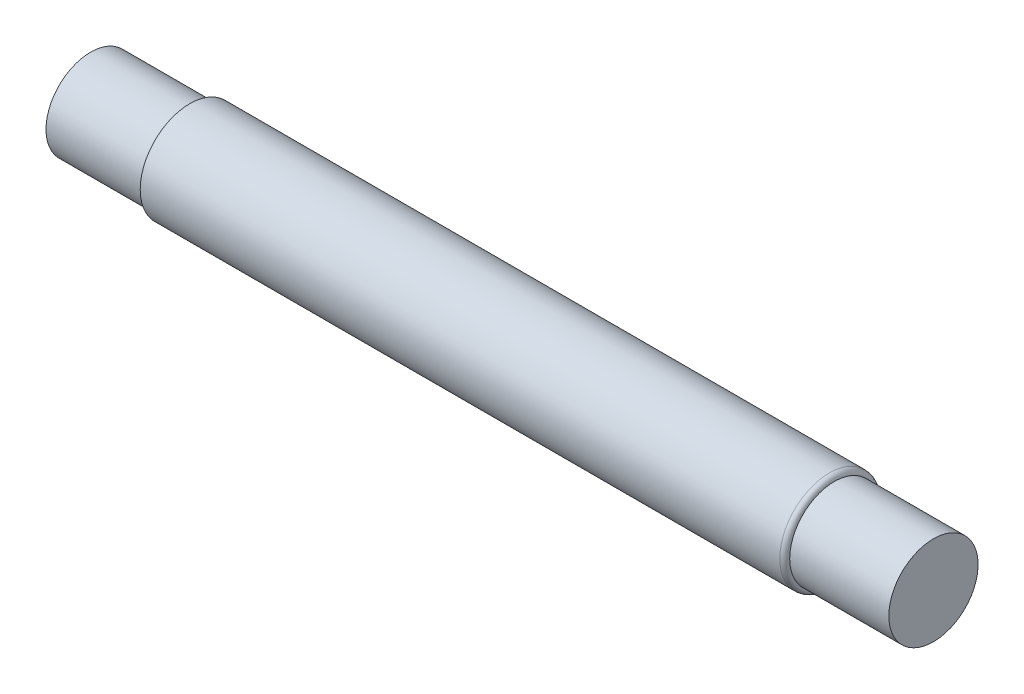
ISO-10303-21;
HEADER;
FILE_DESCRIPTION(('STEP AP214'),'2;1');
FILE_NAME('part.step','',(''),(''),'','','');
FILE_SCHEMA(('AUTOMOTIVE_DESIGN { 1 0 10303 214 1 1 1 1 }'));
ENDSEC;
DATA;
#1=APPLICATION_CONTEXT('core data for automotive mechanical design processes');
#2=APPLICATION_PROTOCOL_DEFINITION('international standard','automotive_design',2000,#1);
#3=PRODUCT_CONTEXT('',#1,'mechanical');
#4=PRODUCT('Part','Part','',(#3));
#5=PRODUCT_RELATED_PRODUCT_CATEGORY('part','',(#4));
#6=PRODUCT_DEFINITION_FORMATION('','',#4);
#7=PRODUCT_DEFINITION_CONTEXT('part definition',#1,'design');
#8=PRODUCT_DEFINITION('design','',#6,#7);
#9=PRODUCT_DEFINITION_SHAPE('','',#8);
#10=(LENGTH_UNIT() NAMED_UNIT(*) SI_UNIT(.MILLI.,.METRE.));
#11=(NAMED_UNIT(*) PLANE_ANGLE_UNIT() SI_UNIT($,.RADIAN.));
#12=(NAMED_UNIT(*) SI_UNIT($,.STERADIAN.) SOLID_ANGLE_UNIT());
#13=UNCERTAINTY_MEASURE_WITH_UNIT(LENGTH_MEASURE(1.E-05),#10,'distance_accuracy_value','');
#14=(GEOMETRIC_REPRESENTATION_CONTEXT(3) GLOBAL_UNCERTAINTY_ASSIGNED_CONTEXT((#13)) GLOBAL_UNIT_ASSIGNED_CONTEXT((#10,
#11,#12)) REPRESENTATION_CONTEXT('',''));
#15=CARTESIAN_POINT('',(0.,0.,0.));
#16=DIRECTION('',(0.,0.,1.));
#17=DIRECTION('',(1.,0.,0.));
#18=AXIS2_PLACEMENT_3D('',#15,#16,#17);
#19=CARTESIAN_POINT('',(0.,18.,0.));
#20=DIRECTION('',(1.,0.,0.));
#21=DIRECTION('',(0.,0.,-1.));
#22=AXIS2_PLACEMENT_3D('',#19,#20,#21);
#23=PLANE('',#22);
#24=CARTESIAN_POINT('',(0.,0.,0.));
#25=DIRECTION('',(-1.,0.,0.));
#26=DIRECTION('',(0.,0.,1.));
#27=AXIS2_PLACEMENT_3D('',#24,#25,#26);
#28=CIRCLE('',#27,18.);
#29=CARTESIAN_POINT('',(0.,0.,18.));
#30=VERTEX_POINT('',#29);
#31=EDGE_CURVE('E60',#30,#30,#28,.T.);
#32=ORIENTED_EDGE('',*,*,#31,.T.);
#33=EDGE_LOOP('',(#32));
#34=FACE_BOUND('',#33,.T.);
#35=ADVANCED_FACE('F37',(#34),#23,.F.);
#36=CARTESIAN_POINT('',(340.,0.,0.));
#37=DIRECTION('',(-1.,0.,0.));
#38=DIRECTION('',(0.,0.,1.));
#39=AXIS2_PLACEMENT_3D('',#36,#37,#38);
#40=PLANE('',#39);
#41=CARTESIAN_POINT('',(340.,0.,0.));
#42=DIRECTION('',(-1.,0.,0.));
#43=DIRECTION('',(0.,0.,1.));
#44=AXIS2_PLACEMENT_3D('',#41,#42,#43);
#45=CIRCLE('',#44,18.);
#46=CARTESIAN_POINT('',(340.,0.,18.));
#47=VERTEX_POINT('',#46);
#48=EDGE_CURVE('E44',#47,#47,#45,.T.);
#49=ORIENTED_EDGE('',*,*,#48,.F.);
#50=EDGE_LOOP('',(#49));
#51=FACE_BOUND('',#50,.T.);
#52=ADVANCED_FACE('F85',(#51),#40,.F.);
#53=CARTESIAN_POINT('',(0.,0.,0.));
#54=DIRECTION('',(-1.,0.,0.));
#55=DIRECTION('',(0.,0.,1.));
#56=AXIS2_PLACEMENT_3D('',#53,#54,#55);
#57=CYLINDRICAL_SURFACE('',#56,18.);
#58=CARTESIAN_POINT('',(300.,0.,0.));
#59=DIRECTION('',(-1.,0.,0.));
#60=DIRECTION('',(0.,0.,1.));
#61=AXIS2_PLACEMENT_3D('',#58,#59,#60);
#62=CIRCLE('',#61,18.);
#63=CARTESIAN_POINT('',(300.,0.,18.));
#64=VERTEX_POINT('',#63);
#65=EDGE_CURVE('E48',#64,#64,#62,.T.);
#66=ORIENTED_EDGE('',*,*,#65,.F.);
#67=EDGE_LOOP('',(#66));
#68=FACE_BOUND('',#67,.T.);
#69=ORIENTED_EDGE('',*,*,#48,.T.);
#70=EDGE_LOOP('',(#69));
#71=FACE_BOUND('',#70,.T.);
#72=ADVANCED_FACE('F79',(#68,#71),#57,.T.);
#73=CARTESIAN_POINT('',(0.,0.,0.));
#74=DIRECTION('',(-1.,0.,0.));
#75=DIRECTION('',(0.,0.,1.));
#76=AXIS2_PLACEMENT_3D('',#73,#74,#75);
#77=CYLINDRICAL_SURFACE('',#76,20.);
#78=CARTESIAN_POINT('',(298.,0.,0.));
#79=DIRECTION('',(-1.,0.,0.));
#80=DIRECTION('',(0.,0.,1.));
#81=AXIS2_PLACEMENT_3D('',#78,#79,#80);
#82=CIRCLE('',#81,20.);
#83=CARTESIAN_POINT('',(298.,0.,20.));
#84=VERTEX_POINT('',#83);
#85=EDGE_CURVE('E10',#84,#84,#82,.T.);
#86=ORIENTED_EDGE('',*,*,#85,.T.);
#87=EDGE_LOOP('',(#86));
#88=FACE_BOUND('',#87,.T.);
#89=CARTESIAN_POINT('',(40.,0.,0.));
#90=DIRECTION('',(-1.,0.,0.));
#91=DIRECTION('',(0.,0.,1.));
#92=AXIS2_PLACEMENT_3D('',#89,#90,#91);
#93=CIRCLE('',#92,20.);
#94=CARTESIAN_POINT('',(40.,0.,20.));
#95=VERTEX_POINT('',#94);
#96=EDGE_CURVE('E52',#95,#95,#93,.T.);
#97=ORIENTED_EDGE('',*,*,#96,.F.);
#98=EDGE_LOOP('',(#97));
#99=FACE_BOUND('',#98,.T.);
#100=ADVANCED_FACE('F74',(#88,#99),#77,.T.);
#101=CARTESIAN_POINT('',(40.,20.,0.));
#102=DIRECTION('',(1.,0.,0.));
#103=DIRECTION('',(0.,0.,-1.));
#104=AXIS2_PLACEMENT_3D('',#101,#102,#103);
#105=PLANE('',#104);
#106=CARTESIAN_POINT('',(40.,0.,0.));
#107=DIRECTION('',(-1.,0.,0.));
#108=DIRECTION('',(0.,0.,1.));
#109=AXIS2_PLACEMENT_3D('',#106,#107,#108);
#110=CIRCLE('',#109,18.);
#111=CARTESIAN_POINT('',(40.,0.,18.));
#112=VERTEX_POINT('',#111);
#113=EDGE_CURVE('E57',#112,#112,#110,.T.);
#114=ORIENTED_EDGE('',*,*,#113,.F.);
#115=EDGE_LOOP('',(#114));
#116=FACE_BOUND('',#115,.T.);
#117=ORIENTED_EDGE('',*,*,#96,.T.);
#118=EDGE_LOOP('',(#117));
#119=FACE_BOUND('',#118,.T.);
#120=ADVANCED_FACE('F68',(#116,#119),#105,.F.);
#121=CARTESIAN_POINT('',(0.,0.,0.));
#122=DIRECTION('',(-1.,0.,0.));
#123=DIRECTION('',(0.,0.,1.));
#124=AXIS2_PLACEMENT_3D('',#121,#122,#123);
#125=CYLINDRICAL_SURFACE('',#124,18.);
#126=ORIENTED_EDGE('',*,*,#31,.F.);
#127=EDGE_LOOP('',(#126));
#128=FACE_BOUND('',#127,.T.);
#129=ORIENTED_EDGE('',*,*,#113,.T.);
#130=EDGE_LOOP('',(#129));
#131=FACE_BOUND('',#130,.T.);
#132=ADVANCED_FACE('F65',(#128,#131),#125,.T.);
#133=CARTESIAN_POINT('',(298.,0.,0.));
#134=DIRECTION('',(-1.,0.,0.));
#135=DIRECTION('',(0.,0.,1.));
#136=AXIS2_PLACEMENT_3D('',#133,#134,#135);
#137=TOROIDAL_SURFACE('',#136,18.,2.);
#138=ORIENTED_EDGE('',*,*,#65,.T.);
#139=EDGE_LOOP('',(#138));
#140=FACE_BOUND('',#139,.T.);
#141=ORIENTED_EDGE('',*,*,#85,.F.);
#142=EDGE_LOOP('',(#141));
#143=FACE_BOUND('',#142,.T.);
#144=ADVANCED_FACE('F39',(#140,#143),#137,.T.);
#145=CLOSED_SHELL('',(#35,#52,#72,#100,#120,#132,#144));
#146=MANIFOLD_SOLID_BREP('B2',#145);
#147=ADVANCED_BREP_SHAPE_REPRESENTATION('',(#18,#146),#14);
#148=SHAPE_DEFINITION_REPRESENTATION(#9,#147);
ENDSEC;
END-ISO-10303-21;
